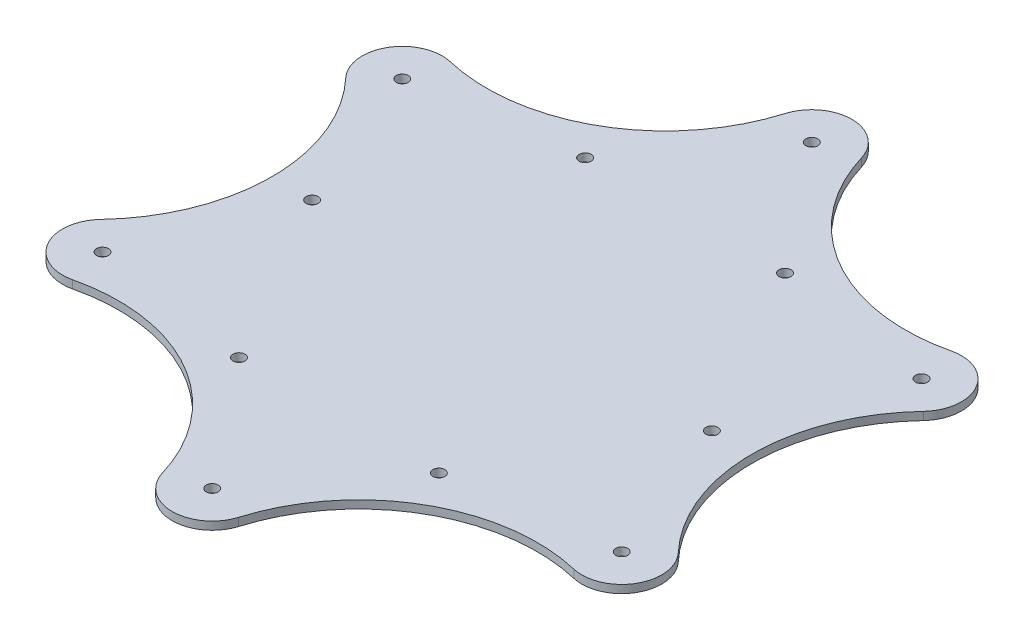
ISO-10303-21;
HEADER;
FILE_DESCRIPTION(('STEP AP214'),'2;1');
FILE_NAME('part.step','',(''),(''),'','','');
FILE_SCHEMA(('AUTOMOTIVE_DESIGN { 1 0 10303 214 1 1 1 1 }'));
ENDSEC;
DATA;
#1=APPLICATION_CONTEXT('core data for automotive mechanical design processes');
#2=APPLICATION_PROTOCOL_DEFINITION('international standard','automotive_design',2000,#1);
#3=PRODUCT_CONTEXT('',#1,'mechanical');
#4=PRODUCT('Part','Part','',(#3));
#5=PRODUCT_RELATED_PRODUCT_CATEGORY('part','',(#4));
#6=PRODUCT_DEFINITION_FORMATION('','',#4);
#7=PRODUCT_DEFINITION_CONTEXT('part definition',#1,'design');
#8=PRODUCT_DEFINITION('design','',#6,#7);
#9=PRODUCT_DEFINITION_SHAPE('','',#8);
#10=(LENGTH_UNIT() NAMED_UNIT(*) SI_UNIT(.MILLI.,.METRE.));
#11=(NAMED_UNIT(*) PLANE_ANGLE_UNIT() SI_UNIT($,.RADIAN.));
#12=(NAMED_UNIT(*) SI_UNIT($,.STERADIAN.) SOLID_ANGLE_UNIT());
#13=UNCERTAINTY_MEASURE_WITH_UNIT(LENGTH_MEASURE(1.E-05),#10,'distance_accuracy_value','');
#14=(GEOMETRIC_REPRESENTATION_CONTEXT(3) GLOBAL_UNCERTAINTY_ASSIGNED_CONTEXT((#13)) GLOBAL_UNIT_ASSIGNED_CONTEXT((#10,
#11,#12)) REPRESENTATION_CONTEXT('',''));
#15=CARTESIAN_POINT('',(0.,0.,0.));
#16=DIRECTION('',(0.,0.,1.));
#17=DIRECTION('',(1.,0.,0.));
#18=AXIS2_PLACEMENT_3D('',#15,#16,#17);
#19=CARTESIAN_POINT('',(26.1866273086382,2.,-82.8563842832961));
#20=DIRECTION('',(0.,-1.,0.));
#21=DIRECTION('',(0.,0.,-1.));
#22=AXIS2_PLACEMENT_3D('',#19,#20,#21);
#23=PLANE('',#22);
#24=CARTESIAN_POINT('',(52.3732546172764,2.,-90.7127685665923));
#25=DIRECTION('',(0.,-1.,0.));
#26=DIRECTION('',(0.,0.,-1.));
#27=AXIS2_PLACEMENT_3D('',#24,#25,#26);
#28=CIRCLE('',#27,44.679638432187);
#29=CARTESIAN_POINT('',(62.7283270389498,2.,-47.249651264989));
#30=VERTEX_POINT('',#29);
#31=CARTESIAN_POINT('',(9.56499623583622,2.,-77.9173356009304));
#32=VERTEX_POINT('',#31);
#33=EDGE_CURVE('E200',#30,#32,#28,.T.);
#34=ORIENTED_EDGE('',*,*,#33,.T.);
#35=CARTESIAN_POINT('',(0.,2.,-75.));
#36=DIRECTION('',(0.,1.,0.));
#37=DIRECTION('',(0.,0.,1.));
#38=AXIS2_PLACEMENT_3D('',#35,#36,#37);
#39=CIRCLE('',#38,10.0000000000009);
#40=CARTESIAN_POINT('',(-9.55523479596104,2.,-77.9491503851232));
#41=VERTEX_POINT('',#40);
#42=EDGE_CURVE('E112',#32,#41,#39,.T.);
#43=ORIENTED_EDGE('',*,*,#42,.T.);
#44=CARTESIAN_POINT('',(-52.3729347176492,2.,-90.7129532607282));
#45=DIRECTION('',(0.,-1.,0.));
#46=DIRECTION('',(0.,0.,-1.));
#47=AXIS2_PLACEMENT_3D('',#44,#45,#46);
#48=CIRCLE('',#47,44.6796384321871);
#49=CARTESIAN_POINT('',(-62.6958939076855,2.,-47.2421975278011));
#50=VERTEX_POINT('',#49);
#51=EDGE_CURVE('E237',#41,#50,#48,.T.);
#52=ORIENTED_EDGE('',*,*,#51,.T.);
#53=CARTESIAN_POINT('',(-64.9519052838329,2.,-37.5));
#54=DIRECTION('',(0.,1.,0.));
#55=DIRECTION('',(0.,0.,1.));
#56=AXIS2_PLACEMENT_3D('',#53,#54,#55);
#57=CIRCLE('',#56,10.0000000000009);
#58=CARTESIAN_POINT('',(-72.2835618349108,2.,-30.6994991201343));
#59=VERTEX_POINT('',#58);
#60=EDGE_CURVE('E257',#50,#59,#57,.T.);
#61=ORIENTED_EDGE('',*,*,#60,.T.);
#62=CARTESIAN_POINT('',(-104.746189334926,2.,-0.000184694135896279));
#63=DIRECTION('',(0.,-1.,0.));
#64=DIRECTION('',(0.,0.,-1.));
#65=AXIS2_PLACEMENT_3D('',#62,#63,#64);
#66=CIRCLE('',#65,44.6796384321873);
#67=CARTESIAN_POINT('',(-72.2608901435209,2.,30.6751380731291));
#68=VERTEX_POINT('',#67);
#69=EDGE_CURVE('E253',#59,#68,#66,.T.);
#70=ORIENTED_EDGE('',*,*,#69,.T.);
#71=CARTESIAN_POINT('',(-64.9519052838329,2.,37.5));
#72=DIRECTION('',(0.,1.,0.));
#73=DIRECTION('',(0.,0.,1.));
#74=AXIS2_PLACEMENT_3D('',#71,#72,#73);
#75=CIRCLE('',#74,10.0000000000009);
#76=CARTESIAN_POINT('',(-62.7283270389497,2.,47.2496512649889));
#77=VERTEX_POINT('',#76);
#78=EDGE_CURVE('E256',#68,#77,#75,.T.);
#79=ORIENTED_EDGE('',*,*,#78,.T.);
#80=CARTESIAN_POINT('',(-52.3732546172764,2.,90.7127685665923));
#81=DIRECTION('',(0.,-1.,0.));
#82=DIRECTION('',(0.,0.,-1.));
#83=AXIS2_PLACEMENT_3D('',#80,#81,#82);
#84=CIRCLE('',#83,44.679638432187);
#85=CARTESIAN_POINT('',(-9.56499623583545,2.,77.9173356009302));
#86=VERTEX_POINT('',#85);
#87=EDGE_CURVE('E261',#77,#86,#84,.T.);
#88=ORIENTED_EDGE('',*,*,#87,.T.);
#89=CARTESIAN_POINT('',(0.,2.,75.));
#90=DIRECTION('',(0.,1.,0.));
#91=DIRECTION('',(0.,0.,1.));
#92=AXIS2_PLACEMENT_3D('',#89,#90,#91);
#93=CIRCLE('',#92,10.0000000000009);
#94=CARTESIAN_POINT('',(9.55523479596106,2.,77.9491503851232));
#95=VERTEX_POINT('',#94);
#96=EDGE_CURVE('E268',#86,#95,#93,.T.);
#97=ORIENTED_EDGE('',*,*,#96,.T.);
#98=CARTESIAN_POINT('',(52.3729347176492,2.,90.7129532607282));
#99=DIRECTION('',(0.,-1.,0.));
#100=DIRECTION('',(0.,0.,-1.));
#101=AXIS2_PLACEMENT_3D('',#98,#99,#100);
#102=CIRCLE('',#101,44.679638432187);
#103=CARTESIAN_POINT('',(62.6958939076855,2.,47.2421975278012));
#104=VERTEX_POINT('',#103);
#105=EDGE_CURVE('E143',#95,#104,#102,.T.);
#106=ORIENTED_EDGE('',*,*,#105,.T.);
#107=CARTESIAN_POINT('',(64.9519052838329,2.,37.5));
#108=DIRECTION('',(0.,1.,0.));
#109=DIRECTION('',(0.,0.,1.));
#110=AXIS2_PLACEMENT_3D('',#107,#108,#109);
#111=CIRCLE('',#110,10.0000000000009);
#112=CARTESIAN_POINT('',(72.2835618349108,2.,30.6994991201343));
#113=VERTEX_POINT('',#112);
#114=EDGE_CURVE('E137',#104,#113,#111,.T.);
#115=ORIENTED_EDGE('',*,*,#114,.T.);
#116=CARTESIAN_POINT('',(104.746189334926,2.,0.000184694135967334));
#117=DIRECTION('',(0.,-1.,0.));
#118=DIRECTION('',(0.,0.,-1.));
#119=AXIS2_PLACEMENT_3D('',#116,#117,#118);
#120=CIRCLE('',#119,44.6796384321872);
#121=CARTESIAN_POINT('',(72.260890143521,2.,-30.675138073129));
#122=VERTEX_POINT('',#121);
#123=EDGE_CURVE('E141',#113,#122,#120,.T.);
#124=ORIENTED_EDGE('',*,*,#123,.T.);
#125=CARTESIAN_POINT('',(64.9519052838329,2.,-37.5));
#126=DIRECTION('',(0.,1.,0.));
#127=DIRECTION('',(0.,0.,1.));
#128=AXIS2_PLACEMENT_3D('',#125,#126,#127);
#129=CIRCLE('',#128,10.0000000000009);
#130=EDGE_CURVE('E57',#122,#30,#129,.T.);
#131=ORIENTED_EDGE('',*,*,#130,.T.);
#132=EDGE_LOOP('',(#34,#43,#52,#61,#70,#79,#88,#97,#106,#115,#124,#131));
#133=FACE_BOUND('',#132,.T.);
#134=CARTESIAN_POINT('',(-64.9519052838329,2.,37.5));
#135=DIRECTION('',(0.,1.,0.));
#136=DIRECTION('',(0.,0.,-1.));
#137=AXIS2_PLACEMENT_3D('',#134,#135,#136);
#138=CIRCLE('',#137,1.5);
#139=CARTESIAN_POINT('',(-64.9519052838329,2.,36.));
#140=VERTEX_POINT('',#139);
#141=EDGE_CURVE('E170',#140,#140,#138,.T.);
#142=ORIENTED_EDGE('',*,*,#141,.F.);
#143=EDGE_LOOP('',(#142));
#144=FACE_BOUND('',#143,.T.);
#145=CARTESIAN_POINT('',(0.,2.,-75.));
#146=DIRECTION('',(0.,1.,0.));
#147=DIRECTION('',(0.,0.,-1.));
#148=AXIS2_PLACEMENT_3D('',#145,#146,#147);
#149=CIRCLE('',#148,1.5);
#150=CARTESIAN_POINT('',(0.,2.,-76.5));
#151=VERTEX_POINT('',#150);
#152=EDGE_CURVE('E434',#151,#151,#149,.T.);
#153=ORIENTED_EDGE('',*,*,#152,.F.);
#154=EDGE_LOOP('',(#153));
#155=FACE_BOUND('',#154,.T.);
#156=CARTESIAN_POINT('',(-25.,2.,-43.301270189222));
#157=DIRECTION('',(0.,1.,0.));
#158=DIRECTION('',(0.,0.,-1.));
#159=AXIS2_PLACEMENT_3D('',#156,#157,#158);
#160=CIRCLE('',#159,1.5);
#161=CARTESIAN_POINT('',(-25.,2.,-44.801270189222));
#162=VERTEX_POINT('',#161);
#163=EDGE_CURVE('E426',#162,#162,#160,.T.);
#164=ORIENTED_EDGE('',*,*,#163,.F.);
#165=EDGE_LOOP('',(#164));
#166=FACE_BOUND('',#165,.T.);
#167=CARTESIAN_POINT('',(-64.9519052838329,2.,-37.5));
#168=DIRECTION('',(0.,1.,0.));
#169=DIRECTION('',(0.,0.,-1.));
#170=AXIS2_PLACEMENT_3D('',#167,#168,#169);
#171=CIRCLE('',#170,1.5);
#172=CARTESIAN_POINT('',(-64.9519052838329,2.,-39.));
#173=VERTEX_POINT('',#172);
#174=EDGE_CURVE('E418',#173,#173,#171,.T.);
#175=ORIENTED_EDGE('',*,*,#174,.F.);
#176=EDGE_LOOP('',(#175));
#177=FACE_BOUND('',#176,.T.);
#178=CARTESIAN_POINT('',(64.9519052838329,2.,-37.5));
#179=DIRECTION('',(0.,1.,0.));
#180=DIRECTION('',(0.,0.,-1.));
#181=AXIS2_PLACEMENT_3D('',#178,#179,#180);
#182=CIRCLE('',#181,1.5);
#183=CARTESIAN_POINT('',(64.9519052838329,2.,-39.));
#184=VERTEX_POINT('',#183);
#185=EDGE_CURVE('E410',#184,#184,#182,.T.);
#186=ORIENTED_EDGE('',*,*,#185,.F.);
#187=EDGE_LOOP('',(#186));
#188=FACE_BOUND('',#187,.T.);
#189=CARTESIAN_POINT('',(64.9519052838329,2.,37.5));
#190=DIRECTION('',(0.,1.,0.));
#191=DIRECTION('',(0.,0.,-1.));
#192=AXIS2_PLACEMENT_3D('',#189,#190,#191);
#193=CIRCLE('',#192,1.5);
#194=CARTESIAN_POINT('',(64.9519052838329,2.,36.));
#195=VERTEX_POINT('',#194);
#196=EDGE_CURVE('E402',#195,#195,#193,.T.);
#197=ORIENTED_EDGE('',*,*,#196,.F.);
#198=EDGE_LOOP('',(#197));
#199=FACE_BOUND('',#198,.T.);
#200=CARTESIAN_POINT('',(25.,2.,-43.3012701892219));
#201=DIRECTION('',(0.,1.,0.));
#202=DIRECTION('',(0.,0.,-1.));
#203=AXIS2_PLACEMENT_3D('',#200,#201,#202);
#204=CIRCLE('',#203,1.5);
#205=CARTESIAN_POINT('',(25.,2.,-44.8012701892219));
#206=VERTEX_POINT('',#205);
#207=EDGE_CURVE('E394',#206,#206,#204,.T.);
#208=ORIENTED_EDGE('',*,*,#207,.F.);
#209=EDGE_LOOP('',(#208));
#210=FACE_BOUND('',#209,.T.);
#211=CARTESIAN_POINT('',(0.,2.,75.));
#212=DIRECTION('',(0.,1.,0.));
#213=DIRECTION('',(0.,0.,-1.));
#214=AXIS2_PLACEMENT_3D('',#211,#212,#213);
#215=CIRCLE('',#214,1.5);
#216=CARTESIAN_POINT('',(0.,2.,73.5));
#217=VERTEX_POINT('',#216);
#218=EDGE_CURVE('E386',#217,#217,#215,.T.);
#219=ORIENTED_EDGE('',*,*,#218,.F.);
#220=EDGE_LOOP('',(#219));
#221=FACE_BOUND('',#220,.T.);
#222=CARTESIAN_POINT('',(-50.,2.,0.));
#223=DIRECTION('',(0.,1.,0.));
#224=DIRECTION('',(0.,0.,-1.));
#225=AXIS2_PLACEMENT_3D('',#222,#223,#224);
#226=CIRCLE('',#225,1.5);
#227=CARTESIAN_POINT('',(-50.,2.,-1.50000000000007));
#228=VERTEX_POINT('',#227);
#229=EDGE_CURVE('E378',#228,#228,#226,.T.);
#230=ORIENTED_EDGE('',*,*,#229,.F.);
#231=EDGE_LOOP('',(#230));
#232=FACE_BOUND('',#231,.T.);
#233=CARTESIAN_POINT('',(25.,2.,43.301270189222));
#234=DIRECTION('',(0.,1.,0.));
#235=DIRECTION('',(0.,0.,-1.));
#236=AXIS2_PLACEMENT_3D('',#233,#234,#235);
#237=CIRCLE('',#236,1.5);
#238=CARTESIAN_POINT('',(25.,2.,41.801270189222));
#239=VERTEX_POINT('',#238);
#240=EDGE_CURVE('E370',#239,#239,#237,.T.);
#241=ORIENTED_EDGE('',*,*,#240,.F.);
#242=EDGE_LOOP('',(#241));
#243=FACE_BOUND('',#242,.T.);
#244=CARTESIAN_POINT('',(-25.,2.,43.3012701892219));
#245=DIRECTION('',(0.,1.,0.));
#246=DIRECTION('',(0.,0.,-1.));
#247=AXIS2_PLACEMENT_3D('',#244,#245,#246);
#248=CIRCLE('',#247,1.5);
#249=CARTESIAN_POINT('',(-25.,2.,41.8012701892219));
#250=VERTEX_POINT('',#249);
#251=EDGE_CURVE('E362',#250,#250,#248,.T.);
#252=ORIENTED_EDGE('',*,*,#251,.F.);
#253=EDGE_LOOP('',(#252));
#254=FACE_BOUND('',#253,.T.);
#255=CARTESIAN_POINT('',(50.,2.,0.));
#256=DIRECTION('',(0.,1.,0.));
#257=DIRECTION('',(0.,0.,-1.));
#258=AXIS2_PLACEMENT_3D('',#255,#256,#257);
#259=CIRCLE('',#258,1.5);
#260=CARTESIAN_POINT('',(50.,2.,-1.49999999999991));
#261=VERTEX_POINT('',#260);
#262=EDGE_CURVE('E351',#261,#261,#259,.T.);
#263=ORIENTED_EDGE('',*,*,#262,.F.);
#264=EDGE_LOOP('',(#263));
#265=FACE_BOUND('',#264,.T.);
#266=ADVANCED_FACE('F39',(#133,#144,#155,#166,#177,#188,#199,#210,#221,#232,#243,#254,#265),#23,.F.);
#267=CARTESIAN_POINT('',(26.1866273086382,0.,-82.8563842832961));
#268=DIRECTION('',(0.,-1.,0.));
#269=DIRECTION('',(0.,0.,-1.));
#270=AXIS2_PLACEMENT_3D('',#267,#268,#269);
#271=PLANE('',#270);
#272=CARTESIAN_POINT('',(-25.,0.,43.3012701892219));
#273=DIRECTION('',(0.,1.,0.));
#274=DIRECTION('',(0.,0.,-1.));
#275=AXIS2_PLACEMENT_3D('',#272,#273,#274);
#276=CIRCLE('',#275,1.5);
#277=CARTESIAN_POINT('',(-25.,0.,41.8012701892219));
#278=VERTEX_POINT('',#277);
#279=EDGE_CURVE('E359',#278,#278,#276,.T.);
#280=ORIENTED_EDGE('',*,*,#279,.T.);
#281=EDGE_LOOP('',(#280));
#282=FACE_BOUND('',#281,.T.);
#283=CARTESIAN_POINT('',(-50.,0.,0.));
#284=DIRECTION('',(0.,1.,0.));
#285=DIRECTION('',(0.,0.,-1.));
#286=AXIS2_PLACEMENT_3D('',#283,#284,#285);
#287=CIRCLE('',#286,1.5);
#288=CARTESIAN_POINT('',(-50.,0.,-1.50000000000007));
#289=VERTEX_POINT('',#288);
#290=EDGE_CURVE('E374',#289,#289,#287,.T.);
#291=ORIENTED_EDGE('',*,*,#290,.T.);
#292=EDGE_LOOP('',(#291));
#293=FACE_BOUND('',#292,.T.);
#294=CARTESIAN_POINT('',(25.,0.,-43.3012701892219));
#295=DIRECTION('',(0.,1.,0.));
#296=DIRECTION('',(0.,0.,-1.));
#297=AXIS2_PLACEMENT_3D('',#294,#295,#296);
#298=CIRCLE('',#297,1.5);
#299=CARTESIAN_POINT('',(25.,0.,-44.8012701892219));
#300=VERTEX_POINT('',#299);
#301=EDGE_CURVE('E390',#300,#300,#298,.T.);
#302=ORIENTED_EDGE('',*,*,#301,.T.);
#303=EDGE_LOOP('',(#302));
#304=FACE_BOUND('',#303,.T.);
#305=CARTESIAN_POINT('',(64.9519052838329,0.,-37.5));
#306=DIRECTION('',(0.,1.,0.));
#307=DIRECTION('',(0.,0.,-1.));
#308=AXIS2_PLACEMENT_3D('',#305,#306,#307);
#309=CIRCLE('',#308,1.5);
#310=CARTESIAN_POINT('',(64.9519052838329,0.,-39.));
#311=VERTEX_POINT('',#310);
#312=EDGE_CURVE('E406',#311,#311,#309,.T.);
#313=ORIENTED_EDGE('',*,*,#312,.T.);
#314=EDGE_LOOP('',(#313));
#315=FACE_BOUND('',#314,.T.);
#316=CARTESIAN_POINT('',(-25.,0.,-43.301270189222));
#317=DIRECTION('',(0.,1.,0.));
#318=DIRECTION('',(0.,0.,-1.));
#319=AXIS2_PLACEMENT_3D('',#316,#317,#318);
#320=CIRCLE('',#319,1.5);
#321=CARTESIAN_POINT('',(-25.,0.,-44.801270189222));
#322=VERTEX_POINT('',#321);
#323=EDGE_CURVE('E422',#322,#322,#320,.T.);
#324=ORIENTED_EDGE('',*,*,#323,.T.);
#325=EDGE_LOOP('',(#324));
#326=FACE_BOUND('',#325,.T.);
#327=CARTESIAN_POINT('',(-64.9519052838329,0.,37.5));
#328=DIRECTION('',(0.,1.,0.));
#329=DIRECTION('',(0.,0.,-1.));
#330=AXIS2_PLACEMENT_3D('',#327,#328,#329);
#331=CIRCLE('',#330,1.5);
#332=CARTESIAN_POINT('',(-64.9519052838329,0.,36.));
#333=VERTEX_POINT('',#332);
#334=EDGE_CURVE('E438',#333,#333,#331,.T.);
#335=ORIENTED_EDGE('',*,*,#334,.T.);
#336=EDGE_LOOP('',(#335));
#337=FACE_BOUND('',#336,.T.);
#338=CARTESIAN_POINT('',(52.3732546172764,0.,-90.7127685665923));
#339=DIRECTION('',(0.,-1.,0.));
#340=DIRECTION('',(0.,0.,-1.));
#341=AXIS2_PLACEMENT_3D('',#338,#339,#340);
#342=CIRCLE('',#341,44.679638432187);
#343=CARTESIAN_POINT('',(62.7283270389498,0.,-47.249651264989));
#344=VERTEX_POINT('',#343);
#345=CARTESIAN_POINT('',(9.56499623583622,0.,-77.9173356009304));
#346=VERTEX_POINT('',#345);
#347=EDGE_CURVE('E165',#344,#346,#342,.T.);
#348=ORIENTED_EDGE('',*,*,#347,.F.);
#349=CARTESIAN_POINT('',(64.9519052838329,0.,-37.5));
#350=DIRECTION('',(0.,1.,0.));
#351=DIRECTION('',(0.,0.,1.));
#352=AXIS2_PLACEMENT_3D('',#349,#350,#351);
#353=CIRCLE('',#352,10.0000000000009);
#354=CARTESIAN_POINT('',(72.260890143521,0.,-30.675138073129));
#355=VERTEX_POINT('',#354);
#356=EDGE_CURVE('E104',#355,#344,#353,.T.);
#357=ORIENTED_EDGE('',*,*,#356,.F.);
#358=CARTESIAN_POINT('',(104.746189334926,0.,0.000184694135967334));
#359=DIRECTION('',(0.,-1.,0.));
#360=DIRECTION('',(0.,0.,-1.));
#361=AXIS2_PLACEMENT_3D('',#358,#359,#360);
#362=CIRCLE('',#361,44.6796384321872);
#363=CARTESIAN_POINT('',(72.2835618349108,0.,30.6994991201343));
#364=VERTEX_POINT('',#363);
#365=EDGE_CURVE('E98',#364,#355,#362,.T.);
#366=ORIENTED_EDGE('',*,*,#365,.F.);
#367=CARTESIAN_POINT('',(64.9519052838329,0.,37.5));
#368=DIRECTION('',(0.,1.,0.));
#369=DIRECTION('',(0.,0.,1.));
#370=AXIS2_PLACEMENT_3D('',#367,#368,#369);
#371=CIRCLE('',#370,10.0000000000009);
#372=CARTESIAN_POINT('',(62.6958939076855,0.,47.2421975278012));
#373=VERTEX_POINT('',#372);
#374=EDGE_CURVE('E152',#373,#364,#371,.T.);
#375=ORIENTED_EDGE('',*,*,#374,.F.);
#376=CARTESIAN_POINT('',(52.3729347176492,0.,90.7129532607282));
#377=DIRECTION('',(0.,-1.,0.));
#378=DIRECTION('',(0.,0.,-1.));
#379=AXIS2_PLACEMENT_3D('',#376,#377,#378);
#380=CIRCLE('',#379,44.679638432187);
#381=CARTESIAN_POINT('',(9.55523479596106,0.,77.9491503851232));
#382=VERTEX_POINT('',#381);
#383=EDGE_CURVE('E191',#382,#373,#380,.T.);
#384=ORIENTED_EDGE('',*,*,#383,.F.);
#385=CARTESIAN_POINT('',(0.,0.,75.));
#386=DIRECTION('',(0.,1.,0.));
#387=DIRECTION('',(0.,0.,1.));
#388=AXIS2_PLACEMENT_3D('',#385,#386,#387);
#389=CIRCLE('',#388,10.0000000000009);
#390=CARTESIAN_POINT('',(-9.56499623583545,0.,77.9173356009302));
#391=VERTEX_POINT('',#390);
#392=EDGE_CURVE('E188',#391,#382,#389,.T.);
#393=ORIENTED_EDGE('',*,*,#392,.F.);
#394=CARTESIAN_POINT('',(-52.3732546172764,0.,90.7127685665923));
#395=DIRECTION('',(0.,-1.,0.));
#396=DIRECTION('',(0.,0.,-1.));
#397=AXIS2_PLACEMENT_3D('',#394,#395,#396);
#398=CIRCLE('',#397,44.679638432187);
#399=CARTESIAN_POINT('',(-62.7283270389497,0.,47.2496512649889));
#400=VERTEX_POINT('',#399);
#401=EDGE_CURVE('E185',#400,#391,#398,.T.);
#402=ORIENTED_EDGE('',*,*,#401,.F.);
#403=CARTESIAN_POINT('',(-64.9519052838329,0.,37.5));
#404=DIRECTION('',(0.,1.,0.));
#405=DIRECTION('',(0.,0.,1.));
#406=AXIS2_PLACEMENT_3D('',#403,#404,#405);
#407=CIRCLE('',#406,10.0000000000009);
#408=CARTESIAN_POINT('',(-72.2608901435209,0.,30.6751380731291));
#409=VERTEX_POINT('',#408);
#410=EDGE_CURVE('E182',#409,#400,#407,.T.);
#411=ORIENTED_EDGE('',*,*,#410,.F.);
#412=CARTESIAN_POINT('',(-104.746189334926,0.,-0.000184694135896279));
#413=DIRECTION('',(0.,-1.,0.));
#414=DIRECTION('',(0.,0.,-1.));
#415=AXIS2_PLACEMENT_3D('',#412,#413,#414);
#416=CIRCLE('',#415,44.6796384321873);
#417=CARTESIAN_POINT('',(-72.2835618349108,0.,-30.6994991201343));
#418=VERTEX_POINT('',#417);
#419=EDGE_CURVE('E179',#418,#409,#416,.T.);
#420=ORIENTED_EDGE('',*,*,#419,.F.);
#421=CARTESIAN_POINT('',(-64.9519052838329,0.,-37.5));
#422=DIRECTION('',(0.,1.,0.));
#423=DIRECTION('',(0.,0.,1.));
#424=AXIS2_PLACEMENT_3D('',#421,#422,#423);
#425=CIRCLE('',#424,10.0000000000009);
#426=CARTESIAN_POINT('',(-62.6958939076855,0.,-47.2421975278011));
#427=VERTEX_POINT('',#426);
#428=EDGE_CURVE('E176',#427,#418,#425,.T.);
#429=ORIENTED_EDGE('',*,*,#428,.F.);
#430=CARTESIAN_POINT('',(-52.3729347176492,0.,-90.7129532607282));
#431=DIRECTION('',(0.,-1.,0.));
#432=DIRECTION('',(0.,0.,-1.));
#433=AXIS2_PLACEMENT_3D('',#430,#431,#432);
#434=CIRCLE('',#433,44.6796384321871);
#435=CARTESIAN_POINT('',(-9.55523479596104,0.,-77.9491503851232));
#436=VERTEX_POINT('',#435);
#437=EDGE_CURVE('E173',#436,#427,#434,.T.);
#438=ORIENTED_EDGE('',*,*,#437,.F.);
#439=CARTESIAN_POINT('',(0.,0.,-75.));
#440=DIRECTION('',(0.,1.,0.));
#441=DIRECTION('',(0.,0.,1.));
#442=AXIS2_PLACEMENT_3D('',#439,#440,#441);
#443=CIRCLE('',#442,10.0000000000009);
#444=EDGE_CURVE('E169',#346,#436,#443,.T.);
#445=ORIENTED_EDGE('',*,*,#444,.F.);
#446=EDGE_LOOP('',(#348,#357,#366,#375,#384,#393,#402,#411,#420,#429,#438,#445));
#447=FACE_BOUND('',#446,.T.);
#448=CARTESIAN_POINT('',(0.,0.,-75.));
#449=DIRECTION('',(0.,1.,0.));
#450=DIRECTION('',(0.,0.,-1.));
#451=AXIS2_PLACEMENT_3D('',#448,#449,#450);
#452=CIRCLE('',#451,1.5);
#453=CARTESIAN_POINT('',(0.,0.,-76.5));
#454=VERTEX_POINT('',#453);
#455=EDGE_CURVE('E430',#454,#454,#452,.T.);
#456=ORIENTED_EDGE('',*,*,#455,.T.);
#457=EDGE_LOOP('',(#456));
#458=FACE_BOUND('',#457,.T.);
#459=CARTESIAN_POINT('',(-64.9519052838329,0.,-37.5));
#460=DIRECTION('',(0.,1.,0.));
#461=DIRECTION('',(0.,0.,-1.));
#462=AXIS2_PLACEMENT_3D('',#459,#460,#461);
#463=CIRCLE('',#462,1.5);
#464=CARTESIAN_POINT('',(-64.9519052838329,0.,-39.));
#465=VERTEX_POINT('',#464);
#466=EDGE_CURVE('E414',#465,#465,#463,.T.);
#467=ORIENTED_EDGE('',*,*,#466,.T.);
#468=EDGE_LOOP('',(#467));
#469=FACE_BOUND('',#468,.T.);
#470=CARTESIAN_POINT('',(64.9519052838329,0.,37.5));
#471=DIRECTION('',(0.,1.,0.));
#472=DIRECTION('',(0.,0.,-1.));
#473=AXIS2_PLACEMENT_3D('',#470,#471,#472);
#474=CIRCLE('',#473,1.5);
#475=CARTESIAN_POINT('',(64.9519052838329,0.,36.));
#476=VERTEX_POINT('',#475);
#477=EDGE_CURVE('E398',#476,#476,#474,.T.);
#478=ORIENTED_EDGE('',*,*,#477,.T.);
#479=EDGE_LOOP('',(#478));
#480=FACE_BOUND('',#479,.T.);
#481=CARTESIAN_POINT('',(0.,0.,75.));
#482=DIRECTION('',(0.,1.,0.));
#483=DIRECTION('',(0.,0.,-1.));
#484=AXIS2_PLACEMENT_3D('',#481,#482,#483);
#485=CIRCLE('',#484,1.5);
#486=CARTESIAN_POINT('',(0.,0.,73.5));
#487=VERTEX_POINT('',#486);
#488=EDGE_CURVE('E382',#487,#487,#485,.T.);
#489=ORIENTED_EDGE('',*,*,#488,.T.);
#490=EDGE_LOOP('',(#489));
#491=FACE_BOUND('',#490,.T.);
#492=CARTESIAN_POINT('',(25.,0.,43.301270189222));
#493=DIRECTION('',(0.,1.,0.));
#494=DIRECTION('',(0.,0.,-1.));
#495=AXIS2_PLACEMENT_3D('',#492,#493,#494);
#496=CIRCLE('',#495,1.5);
#497=CARTESIAN_POINT('',(25.,0.,41.801270189222));
#498=VERTEX_POINT('',#497);
#499=EDGE_CURVE('E366',#498,#498,#496,.T.);
#500=ORIENTED_EDGE('',*,*,#499,.T.);
#501=EDGE_LOOP('',(#500));
#502=FACE_BOUND('',#501,.T.);
#503=CARTESIAN_POINT('',(50.,0.,0.));
#504=DIRECTION('',(0.,1.,0.));
#505=DIRECTION('',(0.,0.,-1.));
#506=AXIS2_PLACEMENT_3D('',#503,#504,#505);
#507=CIRCLE('',#506,1.5);
#508=CARTESIAN_POINT('',(50.,0.,-1.49999999999991));
#509=VERTEX_POINT('',#508);
#510=EDGE_CURVE('E354',#509,#509,#507,.T.);
#511=ORIENTED_EDGE('',*,*,#510,.T.);
#512=EDGE_LOOP('',(#511));
#513=FACE_BOUND('',#512,.T.);
#514=ADVANCED_FACE('F241',(#282,#293,#304,#315,#326,#337,#447,#458,#469,#480,#491,#502,#513),
#271,.T.);
#515=CARTESIAN_POINT('',(52.3732546172764,2.,-90.7127685665923));
#516=DIRECTION('',(0.,-1.,0.));
#517=DIRECTION('',(0.,0.,-1.));
#518=AXIS2_PLACEMENT_3D('',#515,#516,#517);
#519=CYLINDRICAL_SURFACE('',#518,44.679638432187);
#520=ORIENTED_EDGE('',*,*,#347,.T.);
#521=DIRECTION('',(0.,-1.,0.));
#522=VECTOR('',#521,1.);
#523=CARTESIAN_POINT('',(9.56499623583622,2.,-77.9173356009304));
#524=LINE('',#523,#522);
#525=EDGE_CURVE('E11',#32,#346,#524,.T.);
#526=ORIENTED_EDGE('',*,*,#525,.F.);
#527=ORIENTED_EDGE('',*,*,#33,.F.);
#528=DIRECTION('',(0.,-1.,0.));
#529=VECTOR('',#528,1.);
#530=CARTESIAN_POINT('',(62.7283270389498,2.,-47.249651264989));
#531=LINE('',#530,#529);
#532=EDGE_CURVE('E161',#30,#344,#531,.T.);
#533=ORIENTED_EDGE('',*,*,#532,.T.);
#534=EDGE_LOOP('',(#520,#526,#527,#533));
#535=FACE_BOUND('',#534,.T.);
#536=ADVANCED_FACE('F41',(#535),#519,.F.);
#537=CARTESIAN_POINT('',(0.,2.,-75.));
#538=DIRECTION('',(0.,-1.,0.));
#539=DIRECTION('',(0.,0.,-1.));
#540=AXIS2_PLACEMENT_3D('',#537,#538,#539);
#541=CYLINDRICAL_SURFACE('',#540,10.0000000000009);
#542=ORIENTED_EDGE('',*,*,#444,.T.);
#543=DIRECTION('',(0.,-1.,0.));
#544=VECTOR('',#543,1.);
#545=CARTESIAN_POINT('',(-9.55523479596104,2.,-77.9491503851232));
#546=LINE('',#545,#544);
#547=EDGE_CURVE('E49',#41,#436,#546,.T.);
#548=ORIENTED_EDGE('',*,*,#547,.F.);
#549=ORIENTED_EDGE('',*,*,#42,.F.);
#550=ORIENTED_EDGE('',*,*,#525,.T.);
#551=EDGE_LOOP('',(#542,#548,#549,#550));
#552=FACE_BOUND('',#551,.T.);
#553=ADVANCED_FACE('F628',(#552),#541,.T.);
#554=CARTESIAN_POINT('',(-52.3729347176492,2.,-90.7129532607282));
#555=DIRECTION('',(0.,-1.,0.));
#556=DIRECTION('',(0.,0.,-1.));
#557=AXIS2_PLACEMENT_3D('',#554,#555,#556);
#558=CYLINDRICAL_SURFACE('',#557,44.6796384321871);
#559=ORIENTED_EDGE('',*,*,#437,.T.);
#560=DIRECTION('',(0.,-1.,0.));
#561=VECTOR('',#560,1.);
#562=CARTESIAN_POINT('',(-62.6958939076855,2.,-47.2421975278011));
#563=LINE('',#562,#561);
#564=EDGE_CURVE('E227',#50,#427,#563,.T.);
#565=ORIENTED_EDGE('',*,*,#564,.F.);
#566=ORIENTED_EDGE('',*,*,#51,.F.);
#567=ORIENTED_EDGE('',*,*,#547,.T.);
#568=EDGE_LOOP('',(#559,#565,#566,#567));
#569=FACE_BOUND('',#568,.T.);
#570=ADVANCED_FACE('F235',(#569),#558,.F.);
#571=CARTESIAN_POINT('',(-64.9519052838329,2.,-37.5));
#572=DIRECTION('',(0.,-1.,0.));
#573=DIRECTION('',(0.,0.,-1.));
#574=AXIS2_PLACEMENT_3D('',#571,#572,#573);
#575=CYLINDRICAL_SURFACE('',#574,10.0000000000009);
#576=ORIENTED_EDGE('',*,*,#428,.T.);
#577=DIRECTION('',(0.,-1.,0.));
#578=VECTOR('',#577,1.);
#579=CARTESIAN_POINT('',(-72.2835618349108,2.,-30.6994991201343));
#580=LINE('',#579,#578);
#581=EDGE_CURVE('E223',#59,#418,#580,.T.);
#582=ORIENTED_EDGE('',*,*,#581,.F.);
#583=ORIENTED_EDGE('',*,*,#60,.F.);
#584=ORIENTED_EDGE('',*,*,#564,.T.);
#585=EDGE_LOOP('',(#576,#582,#583,#584));
#586=FACE_BOUND('',#585,.T.);
#587=ADVANCED_FACE('F247',(#586),#575,.T.);
#588=CARTESIAN_POINT('',(-104.746189334926,2.,-0.000184694135896279));
#589=DIRECTION('',(0.,-1.,0.));
#590=DIRECTION('',(0.,0.,-1.));
#591=AXIS2_PLACEMENT_3D('',#588,#589,#590);
#592=CYLINDRICAL_SURFACE('',#591,44.6796384321873);
#593=ORIENTED_EDGE('',*,*,#419,.T.);
#594=DIRECTION('',(0.,-1.,0.));
#595=VECTOR('',#594,1.);
#596=CARTESIAN_POINT('',(-72.2608901435209,2.,30.6751380731291));
#597=LINE('',#596,#595);
#598=EDGE_CURVE('E219',#68,#409,#597,.T.);
#599=ORIENTED_EDGE('',*,*,#598,.F.);
#600=ORIENTED_EDGE('',*,*,#69,.F.);
#601=ORIENTED_EDGE('',*,*,#581,.T.);
#602=EDGE_LOOP('',(#593,#599,#600,#601));
#603=FACE_BOUND('',#602,.T.);
#604=ADVANCED_FACE('F251',(#603),#592,.F.);
#605=CARTESIAN_POINT('',(-64.9519052838329,2.,37.5));
#606=DIRECTION('',(0.,-1.,0.));
#607=DIRECTION('',(0.,0.,-1.));
#608=AXIS2_PLACEMENT_3D('',#605,#606,#607);
#609=CYLINDRICAL_SURFACE('',#608,10.0000000000009);
#610=ORIENTED_EDGE('',*,*,#410,.T.);
#611=DIRECTION('',(0.,-1.,0.));
#612=VECTOR('',#611,1.);
#613=CARTESIAN_POINT('',(-62.7283270389497,2.,47.2496512649889));
#614=LINE('',#613,#612);
#615=EDGE_CURVE('E215',#77,#400,#614,.T.);
#616=ORIENTED_EDGE('',*,*,#615,.F.);
#617=ORIENTED_EDGE('',*,*,#78,.F.);
#618=ORIENTED_EDGE('',*,*,#598,.T.);
#619=EDGE_LOOP('',(#610,#616,#617,#618));
#620=FACE_BOUND('',#619,.T.);
#621=ADVANCED_FACE('F593',(#620),#609,.T.);
#622=CARTESIAN_POINT('',(-52.3732546172764,2.,90.7127685665923));
#623=DIRECTION('',(0.,-1.,0.));
#624=DIRECTION('',(0.,0.,-1.));
#625=AXIS2_PLACEMENT_3D('',#622,#623,#624);
#626=CYLINDRICAL_SURFACE('',#625,44.679638432187);
#627=ORIENTED_EDGE('',*,*,#401,.T.);
#628=DIRECTION('',(0.,-1.,0.));
#629=VECTOR('',#628,1.);
#630=CARTESIAN_POINT('',(-9.56499623583545,2.,77.9173356009302));
#631=LINE('',#630,#629);
#632=EDGE_CURVE('E211',#86,#391,#631,.T.);
#633=ORIENTED_EDGE('',*,*,#632,.F.);
#634=ORIENTED_EDGE('',*,*,#87,.F.);
#635=ORIENTED_EDGE('',*,*,#615,.T.);
#636=EDGE_LOOP('',(#627,#633,#634,#635));
#637=FACE_BOUND('',#636,.T.);
#638=ADVANCED_FACE('F584',(#637),#626,.F.);
#639=CARTESIAN_POINT('',(0.,2.,75.));
#640=DIRECTION('',(0.,-1.,0.));
#641=DIRECTION('',(0.,0.,-1.));
#642=AXIS2_PLACEMENT_3D('',#639,#640,#641);
#643=CYLINDRICAL_SURFACE('',#642,10.0000000000009);
#644=ORIENTED_EDGE('',*,*,#392,.T.);
#645=DIRECTION('',(0.,-1.,0.));
#646=VECTOR('',#645,1.);
#647=CARTESIAN_POINT('',(9.55523479596106,2.,77.9491503851232));
#648=LINE('',#647,#646);
#649=EDGE_CURVE('E207',#95,#382,#648,.T.);
#650=ORIENTED_EDGE('',*,*,#649,.F.);
#651=ORIENTED_EDGE('',*,*,#96,.F.);
#652=ORIENTED_EDGE('',*,*,#632,.T.);
#653=EDGE_LOOP('',(#644,#650,#651,#652));
#654=FACE_BOUND('',#653,.T.);
#655=ADVANCED_FACE('F276',(#654),#643,.T.);
#656=CARTESIAN_POINT('',(52.3729347176492,2.,90.7129532607282));
#657=DIRECTION('',(0.,-1.,0.));
#658=DIRECTION('',(0.,0.,-1.));
#659=AXIS2_PLACEMENT_3D('',#656,#657,#658);
#660=CYLINDRICAL_SURFACE('',#659,44.679638432187);
#661=ORIENTED_EDGE('',*,*,#383,.T.);
#662=DIRECTION('',(0.,-1.,0.));
#663=VECTOR('',#662,1.);
#664=CARTESIAN_POINT('',(62.6958939076855,2.,47.2421975278012));
#665=LINE('',#664,#663);
#666=EDGE_CURVE('E154',#104,#373,#665,.T.);
#667=ORIENTED_EDGE('',*,*,#666,.F.);
#668=ORIENTED_EDGE('',*,*,#105,.F.);
#669=ORIENTED_EDGE('',*,*,#649,.T.);
#670=EDGE_LOOP('',(#661,#667,#668,#669));
#671=FACE_BOUND('',#670,.T.);
#672=ADVANCED_FACE('F280',(#671),#660,.F.);
#673=CARTESIAN_POINT('',(64.9519052838329,2.,37.5));
#674=DIRECTION('',(0.,-1.,0.));
#675=DIRECTION('',(0.,0.,-1.));
#676=AXIS2_PLACEMENT_3D('',#673,#674,#675);
#677=CYLINDRICAL_SURFACE('',#676,10.0000000000009);
#678=ORIENTED_EDGE('',*,*,#374,.T.);
#679=DIRECTION('',(0.,-1.,0.));
#680=VECTOR('',#679,1.);
#681=CARTESIAN_POINT('',(72.2835618349108,2.,30.6994991201343));
#682=LINE('',#681,#680);
#683=EDGE_CURVE('E149',#113,#364,#682,.T.);
#684=ORIENTED_EDGE('',*,*,#683,.F.);
#685=ORIENTED_EDGE('',*,*,#114,.F.);
#686=ORIENTED_EDGE('',*,*,#666,.T.);
#687=EDGE_LOOP('',(#678,#684,#685,#686));
#688=FACE_BOUND('',#687,.T.);
#689=ADVANCED_FACE('F150',(#688),#677,.T.);
#690=CARTESIAN_POINT('',(104.746189334926,2.,0.000184694135967334));
#691=DIRECTION('',(0.,-1.,0.));
#692=DIRECTION('',(0.,0.,-1.));
#693=AXIS2_PLACEMENT_3D('',#690,#691,#692);
#694=CYLINDRICAL_SURFACE('',#693,44.6796384321872);
#695=ORIENTED_EDGE('',*,*,#365,.T.);
#696=DIRECTION('',(0.,-1.,0.));
#697=VECTOR('',#696,1.);
#698=CARTESIAN_POINT('',(72.260890143521,2.,-30.675138073129));
#699=LINE('',#698,#697);
#700=EDGE_CURVE('E155',#122,#355,#699,.T.);
#701=ORIENTED_EDGE('',*,*,#700,.F.);
#702=ORIENTED_EDGE('',*,*,#123,.F.);
#703=ORIENTED_EDGE('',*,*,#683,.T.);
#704=EDGE_LOOP('',(#695,#701,#702,#703));
#705=FACE_BOUND('',#704,.T.);
#706=ADVANCED_FACE('F157',(#705),#694,.F.);
#707=CARTESIAN_POINT('',(64.9519052838329,2.,-37.5));
#708=DIRECTION('',(0.,-1.,0.));
#709=DIRECTION('',(0.,0.,-1.));
#710=AXIS2_PLACEMENT_3D('',#707,#708,#709);
#711=CYLINDRICAL_SURFACE('',#710,10.0000000000009);
#712=ORIENTED_EDGE('',*,*,#356,.T.);
#713=ORIENTED_EDGE('',*,*,#532,.F.);
#714=ORIENTED_EDGE('',*,*,#130,.F.);
#715=ORIENTED_EDGE('',*,*,#700,.T.);
#716=EDGE_LOOP('',(#712,#713,#714,#715));
#717=FACE_BOUND('',#716,.T.);
#718=ADVANCED_FACE('F284',(#717),#711,.T.);
#719=CARTESIAN_POINT('',(-64.9519052838329,2.,37.5));
#720=DIRECTION('',(0.,-1.,0.));
#721=DIRECTION('',(0.,0.,-1.));
#722=AXIS2_PLACEMENT_3D('',#719,#720,#721);
#723=CYLINDRICAL_SURFACE('',#722,1.5);
#724=ORIENTED_EDGE('',*,*,#141,.T.);
#725=EDGE_LOOP('',(#724));
#726=FACE_BOUND('',#725,.T.);
#727=ORIENTED_EDGE('',*,*,#334,.F.);
#728=EDGE_LOOP('',(#727));
#729=FACE_BOUND('',#728,.T.);
#730=ADVANCED_FACE('F286',(#726,#729),#723,.F.);
#731=CARTESIAN_POINT('',(0.,2.,-75.));
#732=DIRECTION('',(0.,-1.,0.));
#733=DIRECTION('',(0.,0.,-1.));
#734=AXIS2_PLACEMENT_3D('',#731,#732,#733);
#735=CYLINDRICAL_SURFACE('',#734,1.5);
#736=ORIENTED_EDGE('',*,*,#152,.T.);
#737=EDGE_LOOP('',(#736));
#738=FACE_BOUND('',#737,.T.);
#739=ORIENTED_EDGE('',*,*,#455,.F.);
#740=EDGE_LOOP('',(#739));
#741=FACE_BOUND('',#740,.T.);
#742=ADVANCED_FACE('F292',(#738,#741),#735,.F.);
#743=CARTESIAN_POINT('',(-25.,2.,-43.301270189222));
#744=DIRECTION('',(0.,-1.,0.));
#745=DIRECTION('',(0.,0.,-1.));
#746=AXIS2_PLACEMENT_3D('',#743,#744,#745);
#747=CYLINDRICAL_SURFACE('',#746,1.5);
#748=ORIENTED_EDGE('',*,*,#163,.T.);
#749=EDGE_LOOP('',(#748));
#750=FACE_BOUND('',#749,.T.);
#751=ORIENTED_EDGE('',*,*,#323,.F.);
#752=EDGE_LOOP('',(#751));
#753=FACE_BOUND('',#752,.T.);
#754=ADVANCED_FACE('F306',(#750,#753),#747,.F.);
#755=CARTESIAN_POINT('',(-64.9519052838329,2.,-37.5));
#756=DIRECTION('',(0.,-1.,0.));
#757=DIRECTION('',(0.,0.,-1.));
#758=AXIS2_PLACEMENT_3D('',#755,#756,#757);
#759=CYLINDRICAL_SURFACE('',#758,1.5);
#760=ORIENTED_EDGE('',*,*,#174,.T.);
#761=EDGE_LOOP('',(#760));
#762=FACE_BOUND('',#761,.T.);
#763=ORIENTED_EDGE('',*,*,#466,.F.);
#764=EDGE_LOOP('',(#763));
#765=FACE_BOUND('',#764,.T.);
#766=ADVANCED_FACE('F310',(#762,#765),#759,.F.);
#767=CARTESIAN_POINT('',(64.9519052838329,2.,-37.5));
#768=DIRECTION('',(0.,-1.,0.));
#769=DIRECTION('',(0.,0.,-1.));
#770=AXIS2_PLACEMENT_3D('',#767,#768,#769);
#771=CYLINDRICAL_SURFACE('',#770,1.5);
#772=ORIENTED_EDGE('',*,*,#185,.T.);
#773=EDGE_LOOP('',(#772));
#774=FACE_BOUND('',#773,.T.);
#775=ORIENTED_EDGE('',*,*,#312,.F.);
#776=EDGE_LOOP('',(#775));
#777=FACE_BOUND('',#776,.T.);
#778=ADVANCED_FACE('F314',(#774,#777),#771,.F.);
#779=CARTESIAN_POINT('',(64.9519052838329,2.,37.5));
#780=DIRECTION('',(0.,-1.,0.));
#781=DIRECTION('',(0.,0.,-1.));
#782=AXIS2_PLACEMENT_3D('',#779,#780,#781);
#783=CYLINDRICAL_SURFACE('',#782,1.5);
#784=ORIENTED_EDGE('',*,*,#196,.T.);
#785=EDGE_LOOP('',(#784));
#786=FACE_BOUND('',#785,.T.);
#787=ORIENTED_EDGE('',*,*,#477,.F.);
#788=EDGE_LOOP('',(#787));
#789=FACE_BOUND('',#788,.T.);
#790=ADVANCED_FACE('F318',(#786,#789),#783,.F.);
#791=CARTESIAN_POINT('',(25.,2.,-43.3012701892219));
#792=DIRECTION('',(0.,-1.,0.));
#793=DIRECTION('',(0.,0.,-1.));
#794=AXIS2_PLACEMENT_3D('',#791,#792,#793);
#795=CYLINDRICAL_SURFACE('',#794,1.5);
#796=ORIENTED_EDGE('',*,*,#207,.T.);
#797=EDGE_LOOP('',(#796));
#798=FACE_BOUND('',#797,.T.);
#799=ORIENTED_EDGE('',*,*,#301,.F.);
#800=EDGE_LOOP('',(#799));
#801=FACE_BOUND('',#800,.T.);
#802=ADVANCED_FACE('F322',(#798,#801),#795,.F.);
#803=CARTESIAN_POINT('',(0.,2.,75.));
#804=DIRECTION('',(0.,-1.,0.));
#805=DIRECTION('',(0.,0.,-1.));
#806=AXIS2_PLACEMENT_3D('',#803,#804,#805);
#807=CYLINDRICAL_SURFACE('',#806,1.5);
#808=ORIENTED_EDGE('',*,*,#218,.T.);
#809=EDGE_LOOP('',(#808));
#810=FACE_BOUND('',#809,.T.);
#811=ORIENTED_EDGE('',*,*,#488,.F.);
#812=EDGE_LOOP('',(#811));
#813=FACE_BOUND('',#812,.T.);
#814=ADVANCED_FACE('F326',(#810,#813),#807,.F.);
#815=CARTESIAN_POINT('',(-50.,2.,0.));
#816=DIRECTION('',(0.,-1.,0.));
#817=DIRECTION('',(0.,0.,-1.));
#818=AXIS2_PLACEMENT_3D('',#815,#816,#817);
#819=CYLINDRICAL_SURFACE('',#818,1.5);
#820=ORIENTED_EDGE('',*,*,#229,.T.);
#821=EDGE_LOOP('',(#820));
#822=FACE_BOUND('',#821,.T.);
#823=ORIENTED_EDGE('',*,*,#290,.F.);
#824=EDGE_LOOP('',(#823));
#825=FACE_BOUND('',#824,.T.);
#826=ADVANCED_FACE('F330',(#822,#825),#819,.F.);
#827=CARTESIAN_POINT('',(25.,2.,43.301270189222));
#828=DIRECTION('',(0.,-1.,0.));
#829=DIRECTION('',(0.,0.,-1.));
#830=AXIS2_PLACEMENT_3D('',#827,#828,#829);
#831=CYLINDRICAL_SURFACE('',#830,1.5);
#832=ORIENTED_EDGE('',*,*,#240,.T.);
#833=EDGE_LOOP('',(#832));
#834=FACE_BOUND('',#833,.T.);
#835=ORIENTED_EDGE('',*,*,#499,.F.);
#836=EDGE_LOOP('',(#835));
#837=FACE_BOUND('',#836,.T.);
#838=ADVANCED_FACE('F334',(#834,#837),#831,.F.);
#839=CARTESIAN_POINT('',(-25.,2.,43.3012701892219));
#840=DIRECTION('',(0.,-1.,0.));
#841=DIRECTION('',(0.,0.,-1.));
#842=AXIS2_PLACEMENT_3D('',#839,#840,#841);
#843=CYLINDRICAL_SURFACE('',#842,1.5);
#844=ORIENTED_EDGE('',*,*,#251,.T.);
#845=EDGE_LOOP('',(#844));
#846=FACE_BOUND('',#845,.T.);
#847=ORIENTED_EDGE('',*,*,#279,.F.);
#848=EDGE_LOOP('',(#847));
#849=FACE_BOUND('',#848,.T.);
#850=ADVANCED_FACE('F338',(#846,#849),#843,.F.);
#851=CARTESIAN_POINT('',(50.,2.,0.));
#852=DIRECTION('',(0.,-1.,0.));
#853=DIRECTION('',(0.,0.,-1.));
#854=AXIS2_PLACEMENT_3D('',#851,#852,#853);
#855=CYLINDRICAL_SURFACE('',#854,1.5);
#856=ORIENTED_EDGE('',*,*,#262,.T.);
#857=EDGE_LOOP('',(#856));
#858=FACE_BOUND('',#857,.T.);
#859=ORIENTED_EDGE('',*,*,#510,.F.);
#860=EDGE_LOOP('',(#859));
#861=FACE_BOUND('',#860,.T.);
#862=ADVANCED_FACE('F342',(#858,#861),#855,.F.);
#863=CLOSED_SHELL('',(#266,#514,#536,#553,#570,#587,#604,#621,#638,#655,#672,#689,#706,#718,
#730,#742,#754,#766,#778,#790,#802,#814,#826,#838,#850,#862));
#864=MANIFOLD_SOLID_BREP('B2',#863);
#865=ADVANCED_BREP_SHAPE_REPRESENTATION('',(#18,#864),#14);
#866=SHAPE_DEFINITION_REPRESENTATION(#9,#865);
ENDSEC;
END-ISO-10303-21;
